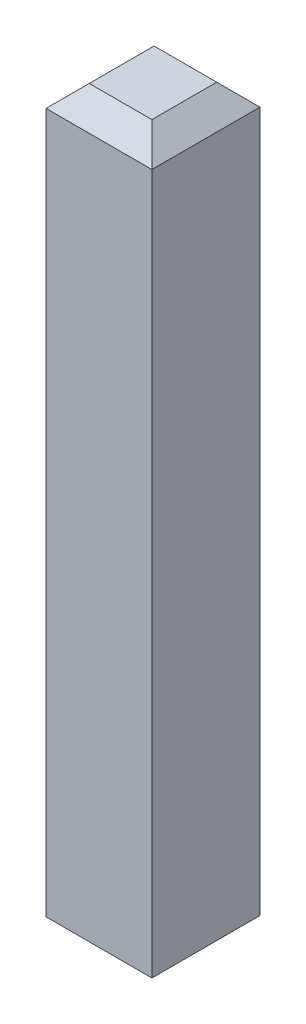
ISO-10303-21;
HEADER;
FILE_DESCRIPTION(('STEP AP214'),'2;1');
FILE_NAME('part.step','',(''),(''),'','','');
FILE_SCHEMA(('AUTOMOTIVE_DESIGN { 1 0 10303 214 1 1 1 1 }'));
ENDSEC;
DATA;
#1=APPLICATION_CONTEXT('core data for automotive mechanical design processes');
#2=APPLICATION_PROTOCOL_DEFINITION('international standard','automotive_design',2000,#1);
#3=PRODUCT_CONTEXT('',#1,'mechanical');
#4=PRODUCT('Part','Part','',(#3));
#5=PRODUCT_RELATED_PRODUCT_CATEGORY('part','',(#4));
#6=PRODUCT_DEFINITION_FORMATION('','',#4);
#7=PRODUCT_DEFINITION_CONTEXT('part definition',#1,'design');
#8=PRODUCT_DEFINITION('design','',#6,#7);
#9=PRODUCT_DEFINITION_SHAPE('','',#8);
#10=(LENGTH_UNIT() NAMED_UNIT(*) SI_UNIT(.MILLI.,.METRE.));
#11=(NAMED_UNIT(*) PLANE_ANGLE_UNIT() SI_UNIT($,.RADIAN.));
#12=(NAMED_UNIT(*) SI_UNIT($,.STERADIAN.) SOLID_ANGLE_UNIT());
#13=UNCERTAINTY_MEASURE_WITH_UNIT(LENGTH_MEASURE(1.E-05),#10,'distance_accuracy_value','');
#14=(GEOMETRIC_REPRESENTATION_CONTEXT(3) GLOBAL_UNCERTAINTY_ASSIGNED_CONTEXT((#13)) GLOBAL_UNIT_ASSIGNED_CONTEXT((#10,
#11,#12)) REPRESENTATION_CONTEXT('',''));
#15=CARTESIAN_POINT('',(0.,0.,0.));
#16=DIRECTION('',(0.,0.,1.));
#17=DIRECTION('',(1.,0.,0.));
#18=AXIS2_PLACEMENT_3D('',#15,#16,#17);
#19=CARTESIAN_POINT('',(0.,16.7,0.));
#20=DIRECTION('',(1.,0.,0.));
#21=DIRECTION('',(0.,0.,-1.));
#22=AXIS2_PLACEMENT_3D('',#19,#20,#21);
#23=PLANE('',#22);
#24=DIRECTION('',(0.,-1.,0.));
#25=VECTOR('',#24,1.);
#26=CARTESIAN_POINT('',(0.,16.7,0.));
#27=LINE('',#26,#25);
#28=CARTESIAN_POINT('',(0.,15.7,0.));
#29=VERTEX_POINT('',#28);
#30=CARTESIAN_POINT('',(0.,-16.7,0.));
#31=VERTEX_POINT('',#30);
#32=EDGE_CURVE('E101',#29,#31,#27,.T.);
#33=ORIENTED_EDGE('',*,*,#32,.F.);
#34=DIRECTION('',(0.,0.,-1.));
#35=VECTOR('',#34,1.);
#36=CARTESIAN_POINT('',(0.,15.7,0.));
#37=LINE('',#36,#35);
#38=CARTESIAN_POINT('',(0.,15.7,-5.));
#39=VERTEX_POINT('',#38);
#40=EDGE_CURVE('E11',#29,#39,#37,.T.);
#41=ORIENTED_EDGE('',*,*,#40,.T.);
#42=DIRECTION('',(0.,-1.,0.));
#43=VECTOR('',#42,1.);
#44=CARTESIAN_POINT('',(0.,16.7,-5.));
#45=LINE('',#44,#43);
#46=CARTESIAN_POINT('',(0.,-16.7,-5.));
#47=VERTEX_POINT('',#46);
#48=EDGE_CURVE('E123',#39,#47,#45,.T.);
#49=ORIENTED_EDGE('',*,*,#48,.T.);
#50=DIRECTION('',(0.,0.,1.));
#51=VECTOR('',#50,1.);
#52=CARTESIAN_POINT('',(0.,-16.7,0.));
#53=LINE('',#52,#51);
#54=EDGE_CURVE('E117',#47,#31,#53,.T.);
#55=ORIENTED_EDGE('',*,*,#54,.T.);
#56=EDGE_LOOP('',(#33,#41,#49,#55));
#57=FACE_BOUND('',#56,.T.);
#58=ADVANCED_FACE('F47',(#57),#23,.F.);
#59=CARTESIAN_POINT('',(0.,16.7,0.));
#60=DIRECTION('',(0.,0.,-1.));
#61=DIRECTION('',(-1.,0.,0.));
#62=AXIS2_PLACEMENT_3D('',#59,#60,#61);
#63=PLANE('',#62);
#64=DIRECTION('',(0.,-1.,0.));
#65=VECTOR('',#64,1.);
#66=CARTESIAN_POINT('',(4.9,16.7,0.));
#67=LINE('',#66,#65);
#68=CARTESIAN_POINT('',(4.9,15.7,0.));
#69=VERTEX_POINT('',#68);
#70=CARTESIAN_POINT('',(4.9,-16.7,0.));
#71=VERTEX_POINT('',#70);
#72=EDGE_CURVE('E111',#69,#71,#67,.T.);
#73=ORIENTED_EDGE('',*,*,#72,.F.);
#74=DIRECTION('',(-1.,0.,0.));
#75=VECTOR('',#74,1.);
#76=CARTESIAN_POINT('',(0.,15.7,0.));
#77=LINE('',#76,#75);
#78=EDGE_CURVE('E58',#69,#29,#77,.T.);
#79=ORIENTED_EDGE('',*,*,#78,.T.);
#80=ORIENTED_EDGE('',*,*,#32,.T.);
#81=DIRECTION('',(1.,0.,0.));
#82=VECTOR('',#81,1.);
#83=CARTESIAN_POINT('',(0.,-16.7,0.));
#84=LINE('',#83,#82);
#85=EDGE_CURVE('E104',#31,#71,#84,.T.);
#86=ORIENTED_EDGE('',*,*,#85,.T.);
#87=EDGE_LOOP('',(#73,#79,#80,#86));
#88=FACE_BOUND('',#87,.T.);
#89=ADVANCED_FACE('F103',(#88),#63,.F.);
#90=CARTESIAN_POINT('',(4.9,16.7,0.));
#91=DIRECTION('',(-1.,0.,0.));
#92=DIRECTION('',(0.,0.,1.));
#93=AXIS2_PLACEMENT_3D('',#90,#91,#92);
#94=PLANE('',#93);
#95=DIRECTION('',(0.,-1.,0.));
#96=VECTOR('',#95,1.);
#97=CARTESIAN_POINT('',(4.9,16.7,-5.));
#98=LINE('',#97,#96);
#99=CARTESIAN_POINT('',(4.9,15.7,-5.));
#100=VERTEX_POINT('',#99);
#101=CARTESIAN_POINT('',(4.9,-16.7,-5.));
#102=VERTEX_POINT('',#101);
#103=EDGE_CURVE('E138',#100,#102,#98,.T.);
#104=ORIENTED_EDGE('',*,*,#103,.F.);
#105=DIRECTION('',(0.,0.,1.));
#106=VECTOR('',#105,1.);
#107=CARTESIAN_POINT('',(4.9,15.7,0.));
#108=LINE('',#107,#106);
#109=EDGE_CURVE('E73',#100,#69,#108,.T.);
#110=ORIENTED_EDGE('',*,*,#109,.T.);
#111=ORIENTED_EDGE('',*,*,#72,.T.);
#112=DIRECTION('',(0.,0.,-1.));
#113=VECTOR('',#112,1.);
#114=CARTESIAN_POINT('',(4.9,-16.7,0.));
#115=LINE('',#114,#113);
#116=EDGE_CURVE('E119',#71,#102,#115,.T.);
#117=ORIENTED_EDGE('',*,*,#116,.T.);
#118=EDGE_LOOP('',(#104,#110,#111,#117));
#119=FACE_BOUND('',#118,.T.);
#120=ADVANCED_FACE('F188',(#119),#94,.F.);
#121=CARTESIAN_POINT('',(0.,16.7,-5.));
#122=DIRECTION('',(0.,0.,1.));
#123=DIRECTION('',(1.,0.,0.));
#124=AXIS2_PLACEMENT_3D('',#121,#122,#123);
#125=PLANE('',#124);
#126=ORIENTED_EDGE('',*,*,#48,.F.);
#127=DIRECTION('',(1.,0.,0.));
#128=VECTOR('',#127,1.);
#129=CARTESIAN_POINT('',(0.,15.7,-5.));
#130=LINE('',#129,#128);
#131=EDGE_CURVE('E155',#39,#100,#130,.T.);
#132=ORIENTED_EDGE('',*,*,#131,.T.);
#133=ORIENTED_EDGE('',*,*,#103,.T.);
#134=DIRECTION('',(-1.,0.,0.));
#135=VECTOR('',#134,1.);
#136=CARTESIAN_POINT('',(0.,-16.7,-5.));
#137=LINE('',#136,#135);
#138=EDGE_CURVE('E133',#102,#47,#137,.T.);
#139=ORIENTED_EDGE('',*,*,#138,.T.);
#140=EDGE_LOOP('',(#126,#132,#133,#139));
#141=FACE_BOUND('',#140,.T.);
#142=ADVANCED_FACE('F187',(#141),#125,.F.);
#143=CARTESIAN_POINT('',(0.,16.7,0.));
#144=DIRECTION('',(0.,-1.,0.));
#145=DIRECTION('',(0.,0.,-1.));
#146=AXIS2_PLACEMENT_3D('',#143,#144,#145);
#147=PLANE('',#146);
#148=DIRECTION('',(0.,0.,-1.));
#149=VECTOR('',#148,1.);
#150=CARTESIAN_POINT('',(3.9,16.7,0.));
#151=LINE('',#150,#149);
#152=CARTESIAN_POINT('',(3.9,16.7,-1.));
#153=VERTEX_POINT('',#152);
#154=CARTESIAN_POINT('',(3.9,16.7,-4.));
#155=VERTEX_POINT('',#154);
#156=EDGE_CURVE('E148',#153,#155,#151,.T.);
#157=ORIENTED_EDGE('',*,*,#156,.T.);
#158=DIRECTION('',(-1.,0.,0.));
#159=VECTOR('',#158,1.);
#160=CARTESIAN_POINT('',(0.,16.7,-4.));
#161=LINE('',#160,#159);
#162=CARTESIAN_POINT('',(1.,16.7,-4.));
#163=VERTEX_POINT('',#162);
#164=EDGE_CURVE('E151',#155,#163,#161,.T.);
#165=ORIENTED_EDGE('',*,*,#164,.T.);
#166=DIRECTION('',(0.,0.,1.));
#167=VECTOR('',#166,1.);
#168=CARTESIAN_POINT('',(1.,16.7,0.));
#169=LINE('',#168,#167);
#170=CARTESIAN_POINT('',(1.,16.7,-1.));
#171=VERTEX_POINT('',#170);
#172=EDGE_CURVE('E110',#163,#171,#169,.T.);
#173=ORIENTED_EDGE('',*,*,#172,.T.);
#174=DIRECTION('',(1.,0.,0.));
#175=VECTOR('',#174,1.);
#176=CARTESIAN_POINT('',(0.,16.7,-1.));
#177=LINE('',#176,#175);
#178=EDGE_CURVE('E145',#171,#153,#177,.T.);
#179=ORIENTED_EDGE('',*,*,#178,.T.);
#180=EDGE_LOOP('',(#157,#165,#173,#179));
#181=FACE_BOUND('',#180,.T.);
#182=ADVANCED_FACE('F180',(#181),#147,.F.);
#183=CARTESIAN_POINT('',(0.,-16.7,0.));
#184=DIRECTION('',(0.,-1.,0.));
#185=DIRECTION('',(0.,0.,-1.));
#186=AXIS2_PLACEMENT_3D('',#183,#184,#185);
#187=PLANE('',#186);
#188=ORIENTED_EDGE('',*,*,#54,.F.);
#189=ORIENTED_EDGE('',*,*,#138,.F.);
#190=ORIENTED_EDGE('',*,*,#116,.F.);
#191=ORIENTED_EDGE('',*,*,#85,.F.);
#192=EDGE_LOOP('',(#188,#189,#190,#191));
#193=FACE_BOUND('',#192,.T.);
#194=ADVANCED_FACE('F115',(#193),#187,.T.);
#195=CARTESIAN_POINT('',(0.,16.7,-1.));
#196=DIRECTION('',(0.,-0.707106781186546,-0.707106781186549));
#197=DIRECTION('',(1.,0.,0.));
#198=AXIS2_PLACEMENT_3D('',#195,#196,#197);
#199=PLANE('',#198);
#200=DIRECTION('',(0.577350269189625,0.577350269189627,-0.577350269189625));
#201=VECTOR('',#200,1.);
#202=CARTESIAN_POINT('',(0.666666666666668,16.3666666666667,-0.666666666666668));
#203=LINE('',#202,#201);
#204=EDGE_CURVE('E129',#29,#171,#203,.T.);
#205=ORIENTED_EDGE('',*,*,#204,.F.);
#206=ORIENTED_EDGE('',*,*,#78,.F.);
#207=DIRECTION('',(-0.577350269189625,0.577350269189627,-0.577350269189625));
#208=VECTOR('',#207,1.);
#209=CARTESIAN_POINT('',(2.6,18.,-2.3));
#210=LINE('',#209,#208);
#211=EDGE_CURVE('E52',#153,#69,#210,.F.);
#212=ORIENTED_EDGE('',*,*,#211,.F.);
#213=ORIENTED_EDGE('',*,*,#178,.F.);
#214=EDGE_LOOP('',(#205,#206,#212,#213));
#215=FACE_BOUND('',#214,.T.);
#216=ADVANCED_FACE('F50',(#215),#199,.F.);
#217=CARTESIAN_POINT('',(3.9,16.7,0.));
#218=DIRECTION('',(-0.707106781186549,-0.707106781186546,0.));
#219=DIRECTION('',(0.,0.,-1.));
#220=AXIS2_PLACEMENT_3D('',#217,#218,#219);
#221=PLANE('',#220);
#222=ORIENTED_EDGE('',*,*,#211,.T.);
#223=ORIENTED_EDGE('',*,*,#109,.F.);
#224=DIRECTION('',(-0.577350269189625,0.577350269189627,0.577350269189625));
#225=VECTOR('',#224,1.);
#226=CARTESIAN_POINT('',(2.56666666666667,18.0333333333333,-2.66666666666667));
#227=LINE('',#226,#225);
#228=EDGE_CURVE('E166',#155,#100,#227,.F.);
#229=ORIENTED_EDGE('',*,*,#228,.F.);
#230=ORIENTED_EDGE('',*,*,#156,.F.);
#231=EDGE_LOOP('',(#222,#223,#229,#230));
#232=FACE_BOUND('',#231,.T.);
#233=ADVANCED_FACE('F213',(#232),#221,.F.);
#234=CARTESIAN_POINT('',(1.,16.7,0.));
#235=DIRECTION('',(0.707106781186549,-0.707106781186546,0.));
#236=DIRECTION('',(0.,0.,1.));
#237=AXIS2_PLACEMENT_3D('',#234,#235,#236);
#238=PLANE('',#237);
#239=ORIENTED_EDGE('',*,*,#204,.T.);
#240=ORIENTED_EDGE('',*,*,#172,.F.);
#241=DIRECTION('',(-0.577350269189625,-0.577350269189627,-0.577350269189625));
#242=VECTOR('',#241,1.);
#243=CARTESIAN_POINT('',(2.33333333333333,18.0333333333333,-2.66666666666667));
#244=LINE('',#243,#242);
#245=EDGE_CURVE('E163',#39,#163,#244,.F.);
#246=ORIENTED_EDGE('',*,*,#245,.F.);
#247=ORIENTED_EDGE('',*,*,#40,.F.);
#248=EDGE_LOOP('',(#239,#240,#246,#247));
#249=FACE_BOUND('',#248,.T.);
#250=ADVANCED_FACE('F173',(#249),#238,.F.);
#251=CARTESIAN_POINT('',(0.,16.7,-4.));
#252=DIRECTION('',(0.,-0.707106781186546,0.707106781186549));
#253=DIRECTION('',(-1.,0.,0.));
#254=AXIS2_PLACEMENT_3D('',#251,#252,#253);
#255=PLANE('',#254);
#256=ORIENTED_EDGE('',*,*,#228,.T.);
#257=ORIENTED_EDGE('',*,*,#131,.F.);
#258=ORIENTED_EDGE('',*,*,#245,.T.);
#259=ORIENTED_EDGE('',*,*,#164,.F.);
#260=EDGE_LOOP('',(#256,#257,#258,#259));
#261=FACE_BOUND('',#260,.T.);
#262=ADVANCED_FACE('F184',(#261),#255,.F.);
#263=CLOSED_SHELL('',(#58,#89,#120,#142,#182,#194,#216,#233,#250,#262));
#264=MANIFOLD_SOLID_BREP('B2',#263);
#265=ADVANCED_BREP_SHAPE_REPRESENTATION('',(#18,#264),#14);
#266=SHAPE_DEFINITION_REPRESENTATION(#9,#265);
ENDSEC;
END-ISO-10303-21;
